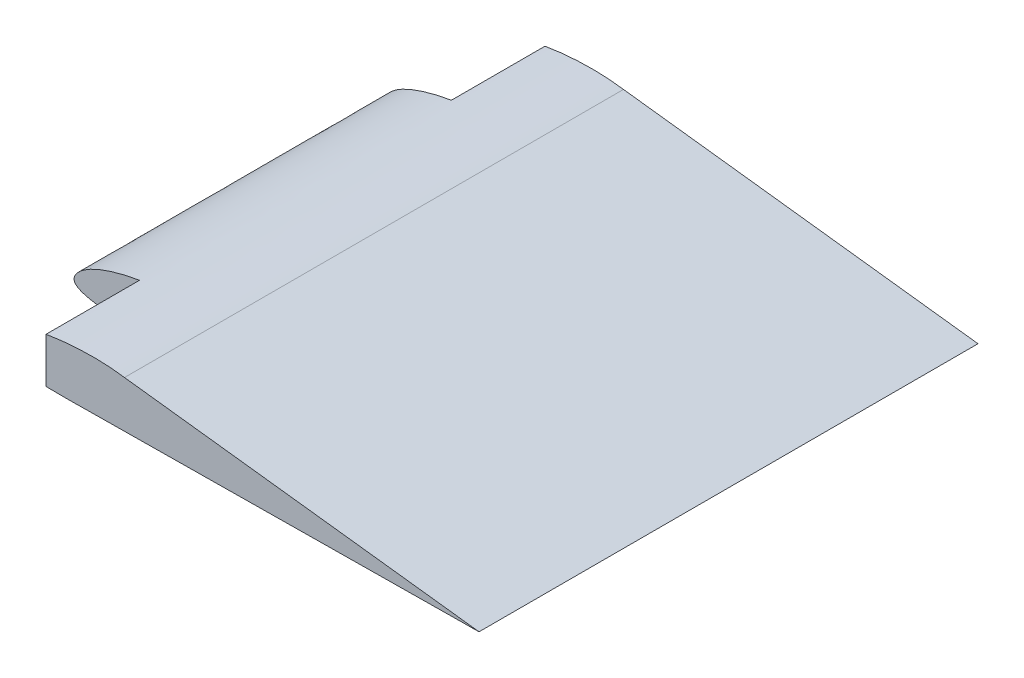
ISO-10303-21;
HEADER;
FILE_DESCRIPTION(('STEP AP214'),'2;1');
FILE_NAME('part.step','',(''),(''),'','','');
FILE_SCHEMA(('AUTOMOTIVE_DESIGN { 1 0 10303 214 1 1 1 1 }'));
ENDSEC;
DATA;
#1=APPLICATION_CONTEXT('core data for automotive mechanical design processes');
#2=APPLICATION_PROTOCOL_DEFINITION('international standard','automotive_design',2000,#1);
#3=PRODUCT_CONTEXT('',#1,'mechanical');
#4=PRODUCT('Part','Part','',(#3));
#5=PRODUCT_RELATED_PRODUCT_CATEGORY('part','',(#4));
#6=PRODUCT_DEFINITION_FORMATION('','',#4);
#7=PRODUCT_DEFINITION_CONTEXT('part definition',#1,'design');
#8=PRODUCT_DEFINITION('design','',#6,#7);
#9=PRODUCT_DEFINITION_SHAPE('','',#8);
#10=(LENGTH_UNIT() NAMED_UNIT(*) SI_UNIT(.MILLI.,.METRE.));
#11=(NAMED_UNIT(*) PLANE_ANGLE_UNIT() SI_UNIT($,.RADIAN.));
#12=(NAMED_UNIT(*) SI_UNIT($,.STERADIAN.) SOLID_ANGLE_UNIT());
#13=UNCERTAINTY_MEASURE_WITH_UNIT(LENGTH_MEASURE(1.E-05),#10,'distance_accuracy_value','');
#14=(GEOMETRIC_REPRESENTATION_CONTEXT(3) GLOBAL_UNCERTAINTY_ASSIGNED_CONTEXT((#13)) GLOBAL_UNIT_ASSIGNED_CONTEXT((#10,
#11,#12)) REPRESENTATION_CONTEXT('',''));
#15=CARTESIAN_POINT('',(0.,0.,0.));
#16=DIRECTION('',(0.,0.,1.));
#17=DIRECTION('',(1.,0.,0.));
#18=AXIS2_PLACEMENT_3D('',#15,#16,#17);
#19=CARTESIAN_POINT('',(7.23879374418921,17.11230520299,0.));
#20=DIRECTION('',(0.,0.,1.));
#21=DIRECTION('',(1.,0.,0.));
#22=AXIS2_PLACEMENT_3D('',#19,#20,#21);
#23=PLANE('',#22);
#24=DIRECTION('',(0.,-1.,0.));
#25=VECTOR('',#24,1.);
#26=CARTESIAN_POINT('',(26.67,25.2206247211432,0.));
#27=LINE('',#26,#25);
#28=CARTESIAN_POINT('',(26.6699999999995,22.9223982032064,0.));
#29=VERTEX_POINT('',#28);
#30=CARTESIAN_POINT('',(26.6700000000038,4.50363658891733,0.));
#31=VERTEX_POINT('',#30);
#32=EDGE_CURVE('E93',#29,#31,#27,.T.);
#33=ORIENTED_EDGE('',*,*,#32,.F.);
#34=CARTESIAN_POINT('',(58.6413359657883,23.6589328190575,0.));
#35=CARTESIAN_POINT('',(37.8051099333301,26.7803166232289,0.));
#36=CARTESIAN_POINT('',(3.9069453785436,20.4434794239586,0.));
#37=CARTESIAN_POINT('',(-2.24664729761774,5.75795695986557,0.));
#38=CARTESIAN_POINT('',(17.8591996040167,4.01341416179109,0.));
#39=CARTESIAN_POINT('',(45.2440857477316,4.54770783629245,0.));
#40=B_SPLINE_CURVE_WITH_KNOTS('',3,(#34,#35,#36,#37,#38,#39),.UNSPECIFIED.,.F.,.F.,(4,1,1,4),
(0.,0.609419042063064,0.709419042063064,1.),.UNSPECIFIED.);
#41=CARTESIAN_POINT('',(58.6413359657883,23.6589328190575,0.));
#42=VERTEX_POINT('',#41);
#43=EDGE_CURVE('E113',#42,#29,#40,.T.);
#44=ORIENTED_EDGE('',*,*,#43,.F.);
#45=DIRECTION('',(-0.992736408193852,0.120309699718558,0.));
#46=VECTOR('',#45,1.);
#47=CARTESIAN_POINT('',(58.6413359657883,23.6589328190575,0.));
#48=LINE('',#47,#46);
#49=CARTESIAN_POINT('',(203.020944151393,6.16157182481742,0.));
#50=VERTEX_POINT('',#49);
#51=EDGE_CURVE('E114',#50,#42,#48,.T.);
#52=ORIENTED_EDGE('',*,*,#51,.F.);
#53=DIRECTION('',(0.999947690185521,0.0102282399581718,0.));
#54=VECTOR('',#53,1.);
#55=CARTESIAN_POINT('',(203.020944151393,6.16157182481742,0.));
#56=LINE('',#55,#54);
#57=CARTESIAN_POINT('',(45.2440857477316,4.54770783629245,0.));
#58=VERTEX_POINT('',#57);
#59=EDGE_CURVE('E112',#58,#50,#56,.T.);
#60=ORIENTED_EDGE('',*,*,#59,.F.);
#61=EDGE_CURVE('E107',#31,#58,#40,.T.);
#62=ORIENTED_EDGE('',*,*,#61,.F.);
#63=EDGE_LOOP('',(#33,#44,#52,#60,#62));
#64=FACE_BOUND('',#63,.T.);
#65=ADVANCED_FACE('F33',(#64),#23,.F.);
#66=CARTESIAN_POINT('',(58.6413359657883,23.6589328190575,203.2));
#67=CARTESIAN_POINT('',(37.8051099333301,26.7803166232289,203.2));
#68=CARTESIAN_POINT('',(3.9069453785436,20.4434794239586,203.2));
#69=CARTESIAN_POINT('',(-2.24664729761774,5.75795695986557,203.2));
#70=CARTESIAN_POINT('',(17.8591996040167,4.01341416179109,203.2));
#71=CARTESIAN_POINT('',(45.2440857477316,4.54770783629245,203.2));
#72=B_SPLINE_CURVE_WITH_KNOTS('',3,(#66,#67,#68,#69,#70,#71),.UNSPECIFIED.,.F.,.F.,(4,1,1,4),
(0.,0.609419042063064,0.709419042063064,1.),.UNSPECIFIED.);
#73=DIRECTION('',(0.,0.,-1.));
#74=VECTOR('',#73,1.);
#75=SURFACE_OF_LINEAR_EXTRUSION('',#72,#74);
#76=ORIENTED_EDGE('',*,*,#43,.T.);
#77=DIRECTION('',(0.,0.,-1.));
#78=VECTOR('',#77,1.);
#79=CARTESIAN_POINT('',(26.67,22.9223982032065,203.2));
#80=LINE('',#79,#78);
#81=CARTESIAN_POINT('',(26.6699999999995,22.9223982032064,38.1));
#82=VERTEX_POINT('',#81);
#83=EDGE_CURVE('E50',#29,#82,#80,.F.);
#84=ORIENTED_EDGE('',*,*,#83,.T.);
#85=CARTESIAN_POINT('',(58.6413359657883,23.6589328190575,38.1));
#86=CARTESIAN_POINT('',(37.8051099333301,26.7803166232289,38.1));
#87=CARTESIAN_POINT('',(3.9069453785436,20.4434794239586,38.1));
#88=CARTESIAN_POINT('',(-2.24664729761774,5.75795695986557,38.1));
#89=CARTESIAN_POINT('',(17.8591996040167,4.01341416179109,38.1));
#90=CARTESIAN_POINT('',(45.2440857477316,4.54770783629245,38.1));
#91=B_SPLINE_CURVE_WITH_KNOTS('',3,(#85,#86,#87,#88,#89,#90),.UNSPECIFIED.,.F.,.F.,(4,1,1,4),
(0.,0.609419042063064,0.709419042063064,1.),.UNSPECIFIED.);
#92=CARTESIAN_POINT('',(26.67,4.50363658891741,38.1));
#93=VERTEX_POINT('',#92);
#94=EDGE_CURVE('E109',#82,#93,#91,.T.);
#95=ORIENTED_EDGE('',*,*,#94,.T.);
#96=DIRECTION('',(0.,0.,-1.));
#97=VECTOR('',#96,1.);
#98=CARTESIAN_POINT('',(26.67,4.50363658891741,203.2));
#99=LINE('',#98,#97);
#100=EDGE_CURVE('E96',#93,#31,#99,.T.);
#101=ORIENTED_EDGE('',*,*,#100,.T.);
#102=ORIENTED_EDGE('',*,*,#61,.T.);
#103=DIRECTION('',(0.,0.,-1.));
#104=VECTOR('',#103,1.);
#105=CARTESIAN_POINT('',(45.2440857477316,4.54770783629245,203.2));
#106=LINE('',#105,#104);
#107=CARTESIAN_POINT('',(45.2440857477316,4.54770783629245,203.2));
#108=VERTEX_POINT('',#107);
#109=EDGE_CURVE('E42',#108,#58,#106,.T.);
#110=ORIENTED_EDGE('',*,*,#109,.F.);
#111=CARTESIAN_POINT('',(26.6700000000038,4.50363658891733,203.2));
#112=VERTEX_POINT('',#111);
#113=EDGE_CURVE('E143',#112,#108,#72,.T.);
#114=ORIENTED_EDGE('',*,*,#113,.F.);
#115=DIRECTION('',(0.,0.,-1.));
#116=VECTOR('',#115,1.);
#117=CARTESIAN_POINT('',(26.67,4.50363658891741,203.2));
#118=LINE('',#117,#116);
#119=CARTESIAN_POINT('',(26.6699999999977,4.50363658891746,165.1));
#120=VERTEX_POINT('',#119);
#121=EDGE_CURVE('E58',#112,#120,#118,.T.);
#122=ORIENTED_EDGE('',*,*,#121,.T.);
#123=CARTESIAN_POINT('',(58.6413359657883,23.6589328190575,165.1));
#124=CARTESIAN_POINT('',(37.8051099333301,26.7803166232289,165.1));
#125=CARTESIAN_POINT('',(3.9069453785436,20.4434794239586,165.1));
#126=CARTESIAN_POINT('',(-2.24664729761774,5.75795695986557,165.1));
#127=CARTESIAN_POINT('',(17.8591996040167,4.01341416179109,165.1));
#128=CARTESIAN_POINT('',(45.2440857477316,4.54770783629245,165.1));
#129=B_SPLINE_CURVE_WITH_KNOTS('',3,(#123,#124,#125,#126,#127,#128),.UNSPECIFIED.,.F.,.F.,(4,1,
1,4),(0.,0.609419042063064,0.709419042063064,1.),.UNSPECIFIED.);
#130=CARTESIAN_POINT('',(26.67,22.9223982032064,165.1));
#131=VERTEX_POINT('',#130);
#132=EDGE_CURVE('E118',#120,#131,#129,.F.);
#133=ORIENTED_EDGE('',*,*,#132,.T.);
#134=DIRECTION('',(0.,0.,-1.));
#135=VECTOR('',#134,1.);
#136=CARTESIAN_POINT('',(26.67,22.9223982032065,203.2));
#137=LINE('',#136,#135);
#138=CARTESIAN_POINT('',(26.6699999999995,22.9223982032064,203.2));
#139=VERTEX_POINT('',#138);
#140=EDGE_CURVE('E230',#131,#139,#137,.F.);
#141=ORIENTED_EDGE('',*,*,#140,.T.);
#142=CARTESIAN_POINT('',(58.6413359657883,23.6589328190575,203.2));
#143=VERTEX_POINT('',#142);
#144=EDGE_CURVE('E139',#143,#139,#72,.T.);
#145=ORIENTED_EDGE('',*,*,#144,.F.);
#146=DIRECTION('',(0.,0.,-1.));
#147=VECTOR('',#146,1.);
#148=CARTESIAN_POINT('',(58.6413359657883,23.6589328190575,203.2));
#149=LINE('',#148,#147);
#150=EDGE_CURVE('E11',#143,#42,#149,.T.);
#151=ORIENTED_EDGE('',*,*,#150,.T.);
#152=EDGE_LOOP('',(#76,#84,#95,#101,#102,#110,#114,#122,#133,#141,#145,#151));
#153=FACE_BOUND('',#152,.T.);
#154=ADVANCED_FACE('F105',(#153),#75,.F.);
#155=CARTESIAN_POINT('',(7.23879374418921,17.11230520299,203.2));
#156=DIRECTION('',(0.,0.,1.));
#157=DIRECTION('',(1.,0.,0.));
#158=AXIS2_PLACEMENT_3D('',#155,#156,#157);
#159=PLANE('',#158);
#160=ORIENTED_EDGE('',*,*,#144,.T.);
#161=DIRECTION('',(0.,-1.,0.));
#162=VECTOR('',#161,1.);
#163=CARTESIAN_POINT('',(26.67,25.2206247211432,203.2));
#164=LINE('',#163,#162);
#165=EDGE_CURVE('E233',#139,#112,#164,.T.);
#166=ORIENTED_EDGE('',*,*,#165,.T.);
#167=ORIENTED_EDGE('',*,*,#113,.T.);
#168=DIRECTION('',(0.999947690185521,0.0102282399581718,0.));
#169=VECTOR('',#168,1.);
#170=CARTESIAN_POINT('',(203.020944151393,6.16157182481742,203.2));
#171=LINE('',#170,#169);
#172=CARTESIAN_POINT('',(203.020944151393,6.16157182481742,203.2));
#173=VERTEX_POINT('',#172);
#174=EDGE_CURVE('E137',#108,#173,#171,.T.);
#175=ORIENTED_EDGE('',*,*,#174,.T.);
#176=DIRECTION('',(-0.992736408193852,0.120309699718558,0.));
#177=VECTOR('',#176,1.);
#178=CARTESIAN_POINT('',(58.6413359657883,23.6589328190575,203.2));
#179=LINE('',#178,#177);
#180=EDGE_CURVE('E133',#173,#143,#179,.T.);
#181=ORIENTED_EDGE('',*,*,#180,.T.);
#182=EDGE_LOOP('',(#160,#166,#167,#175,#181));
#183=FACE_BOUND('',#182,.T.);
#184=ADVANCED_FACE('F157',(#183),#159,.T.);
#185=CARTESIAN_POINT('',(58.6413359657883,23.6589328190575,203.2));
#186=DIRECTION('',(-0.120309699718558,-0.992736408193852,0.));
#187=DIRECTION('',(0.992736408193852,-0.120309699718558,0.));
#188=AXIS2_PLACEMENT_3D('',#185,#186,#187);
#189=PLANE('',#188);
#190=ORIENTED_EDGE('',*,*,#51,.T.);
#191=ORIENTED_EDGE('',*,*,#150,.F.);
#192=ORIENTED_EDGE('',*,*,#180,.F.);
#193=DIRECTION('',(0.,0.,-1.));
#194=VECTOR('',#193,1.);
#195=CARTESIAN_POINT('',(203.020944151393,6.16157182481742,203.2));
#196=LINE('',#195,#194);
#197=EDGE_CURVE('E134',#173,#50,#196,.T.);
#198=ORIENTED_EDGE('',*,*,#197,.T.);
#199=EDGE_LOOP('',(#190,#191,#192,#198));
#200=FACE_BOUND('',#199,.T.);
#201=ADVANCED_FACE('F35',(#200),#189,.F.);
#202=CARTESIAN_POINT('',(203.020944151393,6.16157182481742,203.2));
#203=DIRECTION('',(-0.0102282399581718,0.999947690185521,0.));
#204=DIRECTION('',(-0.999947690185521,-0.0102282399581718,0.));
#205=AXIS2_PLACEMENT_3D('',#202,#203,#204);
#206=PLANE('',#205);
#207=ORIENTED_EDGE('',*,*,#59,.T.);
#208=ORIENTED_EDGE('',*,*,#197,.F.);
#209=ORIENTED_EDGE('',*,*,#174,.F.);
#210=ORIENTED_EDGE('',*,*,#109,.T.);
#211=EDGE_LOOP('',(#207,#208,#209,#210));
#212=FACE_BOUND('',#211,.T.);
#213=ADVANCED_FACE('F158',(#212),#206,.F.);
#214=CARTESIAN_POINT('',(26.67,25.2206247211432,203.2));
#215=DIRECTION('',(-1.,0.,0.));
#216=DIRECTION('',(0.,0.,1.));
#217=AXIS2_PLACEMENT_3D('',#214,#215,#216);
#218=PLANE('',#217);
#219=DIRECTION('',(0.,-1.,0.));
#220=VECTOR('',#219,1.);
#221=CARTESIAN_POINT('',(26.67,25.2206247211432,165.1));
#222=LINE('',#221,#220);
#223=EDGE_CURVE('E235',#131,#120,#222,.T.);
#224=ORIENTED_EDGE('',*,*,#223,.T.);
#225=ORIENTED_EDGE('',*,*,#121,.F.);
#226=ORIENTED_EDGE('',*,*,#165,.F.);
#227=ORIENTED_EDGE('',*,*,#140,.F.);
#228=EDGE_LOOP('',(#224,#225,#226,#227));
#229=FACE_BOUND('',#228,.T.);
#230=ADVANCED_FACE('F161',(#229),#218,.T.);
#231=CARTESIAN_POINT('',(0.,25.2206247211432,165.1));
#232=DIRECTION('',(0.,0.,1.));
#233=DIRECTION('',(1.,0.,0.));
#234=AXIS2_PLACEMENT_3D('',#231,#232,#233);
#235=PLANE('',#234);
#236=ORIENTED_EDGE('',*,*,#223,.F.);
#237=ORIENTED_EDGE('',*,*,#132,.F.);
#238=EDGE_LOOP('',(#236,#237));
#239=FACE_BOUND('',#238,.T.);
#240=ADVANCED_FACE('F170',(#239),#235,.T.);
#241=CARTESIAN_POINT('',(0.,25.2206247211432,38.1));
#242=DIRECTION('',(0.,0.,-1.));
#243=DIRECTION('',(-1.,0.,0.));
#244=AXIS2_PLACEMENT_3D('',#241,#242,#243);
#245=PLANE('',#244);
#246=DIRECTION('',(0.,-1.,0.));
#247=VECTOR('',#246,1.);
#248=CARTESIAN_POINT('',(26.67,25.2206247211432,38.1));
#249=LINE('',#248,#247);
#250=EDGE_CURVE('E101',#82,#93,#249,.T.);
#251=ORIENTED_EDGE('',*,*,#250,.T.);
#252=ORIENTED_EDGE('',*,*,#94,.F.);
#253=EDGE_LOOP('',(#251,#252));
#254=FACE_BOUND('',#253,.T.);
#255=ADVANCED_FACE('F173',(#254),#245,.T.);
#256=CARTESIAN_POINT('',(26.67,25.2206247211432,38.1));
#257=DIRECTION('',(-1.,0.,0.));
#258=DIRECTION('',(0.,0.,1.));
#259=AXIS2_PLACEMENT_3D('',#256,#257,#258);
#260=PLANE('',#259);
#261=ORIENTED_EDGE('',*,*,#32,.T.);
#262=ORIENTED_EDGE('',*,*,#100,.F.);
#263=ORIENTED_EDGE('',*,*,#250,.F.);
#264=ORIENTED_EDGE('',*,*,#83,.F.);
#265=EDGE_LOOP('',(#261,#262,#263,#264));
#266=FACE_BOUND('',#265,.T.);
#267=ADVANCED_FACE('F95',(#266),#260,.T.);
#268=CLOSED_SHELL('',(#65,#154,#184,#201,#213,#230,#240,#255,#267));
#269=MANIFOLD_SOLID_BREP('B2',#268);
#270=ADVANCED_BREP_SHAPE_REPRESENTATION('',(#18,#269),#14);
#271=SHAPE_DEFINITION_REPRESENTATION(#9,#270);
ENDSEC;
END-ISO-10303-21;
